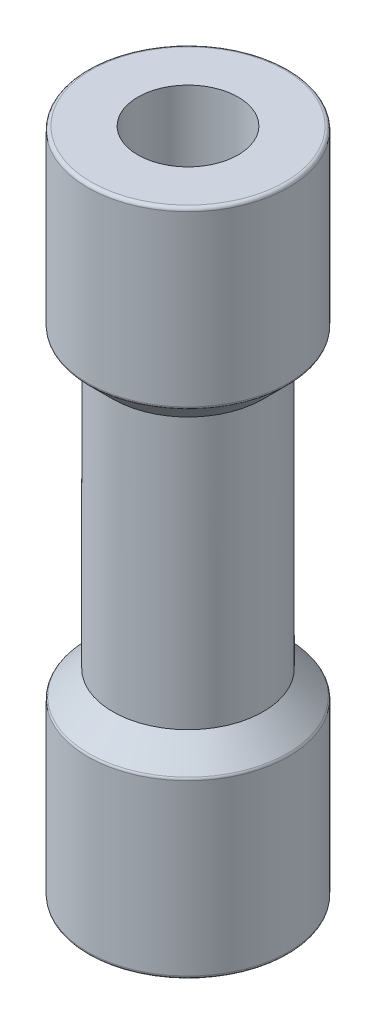
ISO-10303-21;
HEADER;
FILE_DESCRIPTION(('STEP AP214'),'2;1');
FILE_NAME('part.step','',(''),(''),'','','');
FILE_SCHEMA(('AUTOMOTIVE_DESIGN { 1 0 10303 214 1 1 1 1 }'));
ENDSEC;
DATA;
#1=APPLICATION_CONTEXT('core data for automotive mechanical design processes');
#2=APPLICATION_PROTOCOL_DEFINITION('international standard','automotive_design',2000,#1);
#3=PRODUCT_CONTEXT('',#1,'mechanical');
#4=PRODUCT('Part','Part','',(#3));
#5=PRODUCT_RELATED_PRODUCT_CATEGORY('part','',(#4));
#6=PRODUCT_DEFINITION_FORMATION('','',#4);
#7=PRODUCT_DEFINITION_CONTEXT('part definition',#1,'design');
#8=PRODUCT_DEFINITION('design','',#6,#7);
#9=PRODUCT_DEFINITION_SHAPE('','',#8);
#10=(LENGTH_UNIT() NAMED_UNIT(*) SI_UNIT(.MILLI.,.METRE.));
#11=(NAMED_UNIT(*) PLANE_ANGLE_UNIT() SI_UNIT($,.RADIAN.));
#12=(NAMED_UNIT(*) SI_UNIT($,.STERADIAN.) SOLID_ANGLE_UNIT());
#13=UNCERTAINTY_MEASURE_WITH_UNIT(LENGTH_MEASURE(1.E-05),#10,'distance_accuracy_value','');
#14=(GEOMETRIC_REPRESENTATION_CONTEXT(3) GLOBAL_UNCERTAINTY_ASSIGNED_CONTEXT((#13)) GLOBAL_UNIT_ASSIGNED_CONTEXT((#10,
#11,#12)) REPRESENTATION_CONTEXT('',''));
#15=CARTESIAN_POINT('',(0.,0.,0.));
#16=DIRECTION('',(0.,0.,1.));
#17=DIRECTION('',(1.,0.,0.));
#18=AXIS2_PLACEMENT_3D('',#15,#16,#17);
#19=CARTESIAN_POINT('',(0.,0.,0.));
#20=DIRECTION('',(0.,1.,0.));
#21=DIRECTION('',(0.,0.,1.));
#22=AXIS2_PLACEMENT_3D('',#19,#20,#21);
#23=PLANE('',#22);
#24=CARTESIAN_POINT('',(0.,0.,0.));
#25=DIRECTION('',(0.,1.,0.));
#26=DIRECTION('',(0.,0.,1.));
#27=AXIS2_PLACEMENT_3D('',#24,#25,#26);
#28=CIRCLE('',#27,2.9);
#29=CARTESIAN_POINT('',(0.,0.,2.9));
#30=VERTEX_POINT('',#29);
#31=EDGE_CURVE('E41',#30,#30,#28,.F.);
#32=ORIENTED_EDGE('',*,*,#31,.T.);
#33=EDGE_LOOP('',(#32));
#34=FACE_BOUND('',#33,.T.);
#35=CARTESIAN_POINT('',(0.,0.,0.));
#36=DIRECTION('',(0.,1.,0.));
#37=DIRECTION('',(0.,0.,1.));
#38=AXIS2_PLACEMENT_3D('',#35,#36,#37);
#39=CIRCLE('',#38,1.5);
#40=CARTESIAN_POINT('',(0.,0.,1.5));
#41=VERTEX_POINT('',#40);
#42=EDGE_CURVE('E72',#41,#41,#39,.T.);
#43=ORIENTED_EDGE('',*,*,#42,.T.);
#44=EDGE_LOOP('',(#43));
#45=FACE_BOUND('',#44,.T.);
#46=ADVANCED_FACE('F34',(#34,#45),#23,.F.);
#47=CARTESIAN_POINT('',(0.,6.,0.));
#48=DIRECTION('',(0.,-1.,0.));
#49=DIRECTION('',(0.,0.,-1.));
#50=AXIS2_PLACEMENT_3D('',#47,#48,#49);
#51=CYLINDRICAL_SURFACE('',#50,3.);
#52=CARTESIAN_POINT('',(0.,5.15857864376269,0.));
#53=DIRECTION('',(0.,1.,0.));
#54=DIRECTION('',(0.,0.,1.));
#55=AXIS2_PLACEMENT_3D('',#52,#53,#54);
#56=CIRCLE('',#55,3.);
#57=CARTESIAN_POINT('',(0.,5.15857864376269,3.));
#58=VERTEX_POINT('',#57);
#59=EDGE_CURVE('E60',#58,#58,#56,.F.);
#60=ORIENTED_EDGE('',*,*,#59,.T.);
#61=EDGE_LOOP('',(#60));
#62=FACE_BOUND('',#61,.T.);
#63=CARTESIAN_POINT('',(0.,0.1,0.));
#64=DIRECTION('',(0.,1.,0.));
#65=DIRECTION('',(0.,0.,1.));
#66=AXIS2_PLACEMENT_3D('',#63,#64,#65);
#67=CIRCLE('',#66,3.);
#68=CARTESIAN_POINT('',(0.,0.1,3.));
#69=VERTEX_POINT('',#68);
#70=EDGE_CURVE('E63',#69,#69,#67,.T.);
#71=ORIENTED_EDGE('',*,*,#70,.T.);
#72=EDGE_LOOP('',(#71));
#73=FACE_BOUND('',#72,.T.);
#74=ADVANCED_FACE('F96',(#62,#73),#51,.T.);
#75=CARTESIAN_POINT('',(0.,6.,0.));
#76=DIRECTION('',(0.,-1.,0.));
#77=DIRECTION('',(0.,0.,-1.));
#78=AXIS2_PLACEMENT_3D('',#75,#76,#77);
#79=CYLINDRICAL_SURFACE('',#78,1.5);
#80=ORIENTED_EDGE('',*,*,#42,.F.);
#81=EDGE_LOOP('',(#80));
#82=FACE_BOUND('',#81,.T.);
#83=CARTESIAN_POINT('',(0.,20.,0.));
#84=DIRECTION('',(0.,1.,0.));
#85=DIRECTION('',(0.,0.,1.));
#86=AXIS2_PLACEMENT_3D('',#83,#84,#85);
#87=CIRCLE('',#86,1.5);
#88=CARTESIAN_POINT('',(0.,20.,1.5));
#89=VERTEX_POINT('',#88);
#90=EDGE_CURVE('E75',#89,#89,#87,.T.);
#91=ORIENTED_EDGE('',*,*,#90,.T.);
#92=EDGE_LOOP('',(#91));
#93=FACE_BOUND('',#92,.T.);
#94=ADVANCED_FACE('F79',(#82,#93),#79,.F.);
#95=CARTESIAN_POINT('',(0.,14.,0.));
#96=DIRECTION('',(0.,-1.,0.));
#97=DIRECTION('',(0.,0.,-1.));
#98=AXIS2_PLACEMENT_3D('',#95,#96,#97);
#99=CYLINDRICAL_SURFACE('',#98,2.25);
#100=CARTESIAN_POINT('',(0.,14.05,0.));
#101=DIRECTION('',(0.,1.,0.));
#102=DIRECTION('',(0.,0.,1.));
#103=AXIS2_PLACEMENT_3D('',#100,#101,#102);
#104=CIRCLE('',#103,2.25);
#105=CARTESIAN_POINT('',(0.,14.05,2.25));
#106=VERTEX_POINT('',#105);
#107=EDGE_CURVE('E66',#106,#106,#104,.F.);
#108=ORIENTED_EDGE('',*,*,#107,.T.);
#109=EDGE_LOOP('',(#108));
#110=FACE_BOUND('',#109,.T.);
#111=CARTESIAN_POINT('',(0.,5.94999999999999,0.));
#112=DIRECTION('',(0.,-1.,0.));
#113=DIRECTION('',(0.,0.,-1.));
#114=AXIS2_PLACEMENT_3D('',#111,#112,#113);
#115=CIRCLE('',#114,2.25);
#116=CARTESIAN_POINT('',(0.,5.94999999999999,-2.25));
#117=VERTEX_POINT('',#116);
#118=EDGE_CURVE('E69',#117,#117,#115,.F.);
#119=ORIENTED_EDGE('',*,*,#118,.T.);
#120=EDGE_LOOP('',(#119));
#121=FACE_BOUND('',#120,.T.);
#122=ADVANCED_FACE('F84',(#110,#121),#99,.T.);
#123=CARTESIAN_POINT('',(0.,20.,0.));
#124=DIRECTION('',(0.,1.,0.));
#125=DIRECTION('',(0.,0.,1.));
#126=AXIS2_PLACEMENT_3D('',#123,#124,#125);
#127=PLANE('',#126);
#128=CARTESIAN_POINT('',(0.,20.,0.));
#129=DIRECTION('',(0.,1.,0.));
#130=DIRECTION('',(0.,0.,1.));
#131=AXIS2_PLACEMENT_3D('',#128,#129,#130);
#132=CIRCLE('',#131,2.9);
#133=CARTESIAN_POINT('',(0.,20.,2.9));
#134=VERTEX_POINT('',#133);
#135=EDGE_CURVE('E10',#134,#134,#132,.T.);
#136=ORIENTED_EDGE('',*,*,#135,.T.);
#137=EDGE_LOOP('',(#136));
#138=FACE_BOUND('',#137,.T.);
#139=ORIENTED_EDGE('',*,*,#90,.F.);
#140=EDGE_LOOP('',(#139));
#141=FACE_BOUND('',#140,.T.);
#142=ADVANCED_FACE('F81',(#138,#141),#127,.T.);
#143=CARTESIAN_POINT('',(0.,20.,0.));
#144=DIRECTION('',(0.,-1.,0.));
#145=DIRECTION('',(0.,0.,-1.));
#146=AXIS2_PLACEMENT_3D('',#143,#144,#145);
#147=CYLINDRICAL_SURFACE('',#146,3.);
#148=CARTESIAN_POINT('',(0.,14.8414213562373,0.));
#149=DIRECTION('',(0.,-1.,0.));
#150=DIRECTION('',(0.,0.,-1.));
#151=AXIS2_PLACEMENT_3D('',#148,#149,#150);
#152=CIRCLE('',#151,3.);
#153=CARTESIAN_POINT('',(0.,14.8414213562373,-3.));
#154=VERTEX_POINT('',#153);
#155=EDGE_CURVE('E49',#154,#154,#152,.F.);
#156=ORIENTED_EDGE('',*,*,#155,.T.);
#157=EDGE_LOOP('',(#156));
#158=FACE_BOUND('',#157,.T.);
#159=CARTESIAN_POINT('',(0.,19.9,0.));
#160=DIRECTION('',(0.,1.,0.));
#161=DIRECTION('',(0.,0.,1.));
#162=AXIS2_PLACEMENT_3D('',#159,#160,#161);
#163=CIRCLE('',#162,3.);
#164=CARTESIAN_POINT('',(0.,19.9,3.));
#165=VERTEX_POINT('',#164);
#166=EDGE_CURVE('E54',#165,#165,#163,.F.);
#167=ORIENTED_EDGE('',*,*,#166,.T.);
#168=EDGE_LOOP('',(#167));
#169=FACE_BOUND('',#168,.T.);
#170=ADVANCED_FACE('F83',(#158,#169),#147,.T.);
#171=CARTESIAN_POINT('',(0.,6.,0.));
#172=DIRECTION('',(0.,-1.,0.));
#173=DIRECTION('',(0.,0.,-1.));
#174=AXIS2_PLACEMENT_3D('',#171,#172,#173);
#175=CONICAL_SURFACE('',#174,2.19999999999999,0.785398163397453);
#176=CARTESIAN_POINT('',(0.,5.22928932188134,0.));
#177=DIRECTION('',(0.,-1.,0.));
#178=DIRECTION('',(0.,0.,-1.));
#179=AXIS2_PLACEMENT_3D('',#176,#177,#178);
#180=CIRCLE('',#179,2.97071067811865);
#181=CARTESIAN_POINT('',(0.,5.22928932188134,-2.97071067811865));
#182=VERTEX_POINT('',#181);
#183=EDGE_CURVE('E57',#182,#182,#180,.F.);
#184=ORIENTED_EDGE('',*,*,#183,.T.);
#185=EDGE_LOOP('',(#184));
#186=FACE_BOUND('',#185,.T.);
#187=ORIENTED_EDGE('',*,*,#118,.F.);
#188=EDGE_LOOP('',(#187));
#189=FACE_BOUND('',#188,.T.);
#190=ADVANCED_FACE('F90',(#186,#189),#175,.T.);
#191=CARTESIAN_POINT('',(0.,14.8,0.));
#192=DIRECTION('',(0.,1.,0.));
#193=DIRECTION('',(0.,0.,1.));
#194=AXIS2_PLACEMENT_3D('',#191,#192,#193);
#195=CONICAL_SURFACE('',#194,3.,0.785398163397443);
#196=CARTESIAN_POINT('',(0.,14.7707106781187,0.));
#197=DIRECTION('',(0.,1.,0.));
#198=DIRECTION('',(0.,0.,1.));
#199=AXIS2_PLACEMENT_3D('',#196,#197,#198);
#200=CIRCLE('',#199,2.97071067811866);
#201=CARTESIAN_POINT('',(0.,14.7707106781187,2.97071067811866));
#202=VERTEX_POINT('',#201);
#203=EDGE_CURVE('E45',#202,#202,#200,.F.);
#204=ORIENTED_EDGE('',*,*,#203,.T.);
#205=EDGE_LOOP('',(#204));
#206=FACE_BOUND('',#205,.T.);
#207=ORIENTED_EDGE('',*,*,#107,.F.);
#208=EDGE_LOOP('',(#207));
#209=FACE_BOUND('',#208,.T.);
#210=ADVANCED_FACE('F112',(#206,#209),#195,.T.);
#211=CARTESIAN_POINT('',(0.,5.15857864376269,0.));
#212=DIRECTION('',(0.,1.,0.));
#213=DIRECTION('',(0.,0.,1.));
#214=AXIS2_PLACEMENT_3D('',#211,#212,#213);
#215=TOROIDAL_SURFACE('',#214,2.9,0.1);
#216=ORIENTED_EDGE('',*,*,#183,.F.);
#217=EDGE_LOOP('',(#216));
#218=FACE_BOUND('',#217,.T.);
#219=ORIENTED_EDGE('',*,*,#59,.F.);
#220=EDGE_LOOP('',(#219));
#221=FACE_BOUND('',#220,.T.);
#222=ADVANCED_FACE('F118',(#218,#221),#215,.T.);
#223=CARTESIAN_POINT('',(0.,14.8414213562373,0.));
#224=DIRECTION('',(0.,-1.,0.));
#225=DIRECTION('',(0.,0.,-1.));
#226=AXIS2_PLACEMENT_3D('',#223,#224,#225);
#227=TOROIDAL_SURFACE('',#226,2.9,0.1);
#228=ORIENTED_EDGE('',*,*,#203,.F.);
#229=EDGE_LOOP('',(#228));
#230=FACE_BOUND('',#229,.T.);
#231=ORIENTED_EDGE('',*,*,#155,.F.);
#232=EDGE_LOOP('',(#231));
#233=FACE_BOUND('',#232,.T.);
#234=ADVANCED_FACE('F122',(#230,#233),#227,.T.);
#235=CARTESIAN_POINT('',(0.,0.1,0.));
#236=DIRECTION('',(0.,1.,0.));
#237=DIRECTION('',(0.,0.,1.));
#238=AXIS2_PLACEMENT_3D('',#235,#236,#237);
#239=TOROIDAL_SURFACE('',#238,2.9,0.1);
#240=ORIENTED_EDGE('',*,*,#31,.F.);
#241=EDGE_LOOP('',(#240));
#242=FACE_BOUND('',#241,.T.);
#243=ORIENTED_EDGE('',*,*,#70,.F.);
#244=EDGE_LOOP('',(#243));
#245=FACE_BOUND('',#244,.T.);
#246=ADVANCED_FACE('F125',(#242,#245),#239,.T.);
#247=CARTESIAN_POINT('',(0.,19.9,0.));
#248=DIRECTION('',(0.,1.,0.));
#249=DIRECTION('',(0.,0.,1.));
#250=AXIS2_PLACEMENT_3D('',#247,#248,#249);
#251=TOROIDAL_SURFACE('',#250,2.9,0.1);
#252=ORIENTED_EDGE('',*,*,#166,.F.);
#253=EDGE_LOOP('',(#252));
#254=FACE_BOUND('',#253,.T.);
#255=ORIENTED_EDGE('',*,*,#135,.F.);
#256=EDGE_LOOP('',(#255));
#257=FACE_BOUND('',#256,.T.);
#258=ADVANCED_FACE('F36',(#254,#257),#251,.T.);
#259=CLOSED_SHELL('',(#46,#74,#94,#122,#142,#170,#190,#210,#222,#234,#246,#258));
#260=MANIFOLD_SOLID_BREP('B2',#259);
#261=ADVANCED_BREP_SHAPE_REPRESENTATION('',(#18,#260),#14);
#262=SHAPE_DEFINITION_REPRESENTATION(#9,#261);
ENDSEC;
END-ISO-10303-21;
